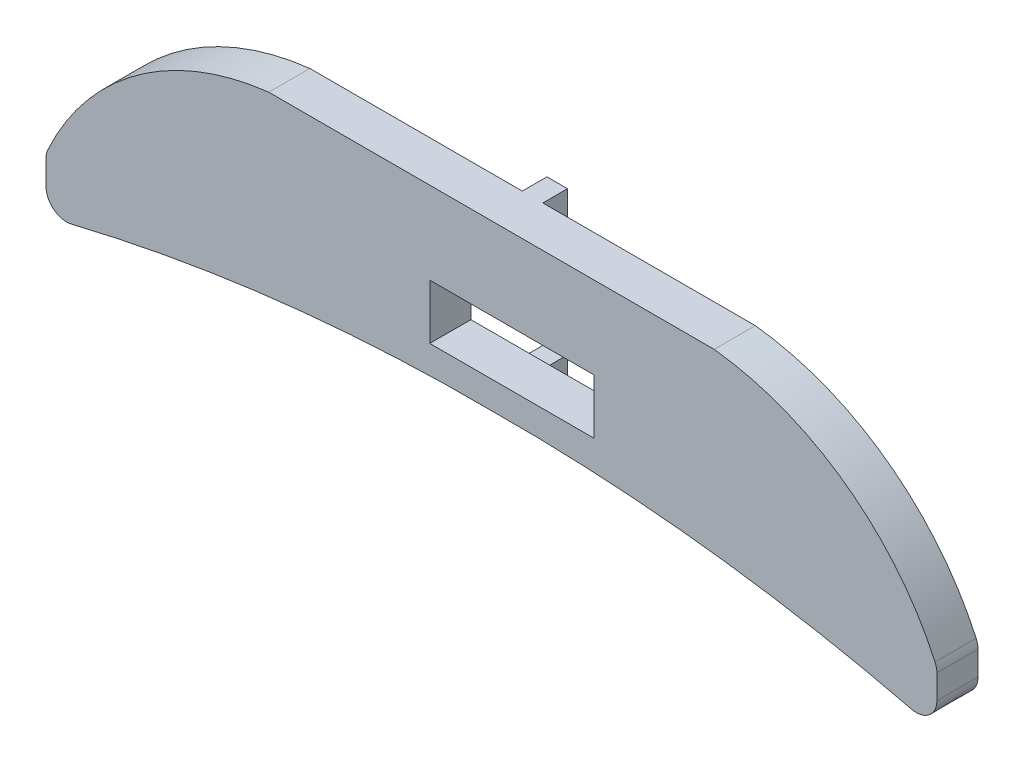
ISO-10303-21;
HEADER;
FILE_DESCRIPTION(('STEP AP214'),'2;1');
FILE_NAME('part.step','',(''),(''),'','','');
FILE_SCHEMA(('AUTOMOTIVE_DESIGN { 1 0 10303 214 1 1 1 1 }'));
ENDSEC;
DATA;
#1=APPLICATION_CONTEXT('core data for automotive mechanical design processes');
#2=APPLICATION_PROTOCOL_DEFINITION('international standard','automotive_design',2000,#1);
#3=PRODUCT_CONTEXT('',#1,'mechanical');
#4=PRODUCT('Part','Part','',(#3));
#5=PRODUCT_RELATED_PRODUCT_CATEGORY('part','',(#4));
#6=PRODUCT_DEFINITION_FORMATION('','',#4);
#7=PRODUCT_DEFINITION_CONTEXT('part definition',#1,'design');
#8=PRODUCT_DEFINITION('design','',#6,#7);
#9=PRODUCT_DEFINITION_SHAPE('','',#8);
#10=(LENGTH_UNIT() NAMED_UNIT(*) SI_UNIT(.MILLI.,.METRE.));
#11=(NAMED_UNIT(*) PLANE_ANGLE_UNIT() SI_UNIT($,.RADIAN.));
#12=(NAMED_UNIT(*) SI_UNIT($,.STERADIAN.) SOLID_ANGLE_UNIT());
#13=UNCERTAINTY_MEASURE_WITH_UNIT(LENGTH_MEASURE(1.E-05),#10,'distance_accuracy_value','');
#14=(GEOMETRIC_REPRESENTATION_CONTEXT(3) GLOBAL_UNCERTAINTY_ASSIGNED_CONTEXT((#13)) GLOBAL_UNIT_ASSIGNED_CONTEXT((#10,
#11,#12)) REPRESENTATION_CONTEXT('',''));
#15=CARTESIAN_POINT('',(0.,0.,0.));
#16=DIRECTION('',(0.,0.,1.));
#17=DIRECTION('',(1.,0.,0.));
#18=AXIS2_PLACEMENT_3D('',#15,#16,#17);
#19=CARTESIAN_POINT('',(0.,0.,0.));
#20=DIRECTION('',(0.,0.,1.));
#21=DIRECTION('',(1.,0.,0.));
#22=AXIS2_PLACEMENT_3D('',#19,#20,#21);
#23=PLANE('',#22);
#24=DIRECTION('',(0.,-1.,0.));
#25=VECTOR('',#24,1.);
#26=CARTESIAN_POINT('',(-25.,0.,0.));
#27=LINE('',#26,#25);
#28=CARTESIAN_POINT('',(-25.,6.,0.));
#29=VERTEX_POINT('',#28);
#30=CARTESIAN_POINT('',(-25.,2.,0.));
#31=VERTEX_POINT('',#30);
#32=EDGE_CURVE('E271',#29,#31,#27,.T.);
#33=ORIENTED_EDGE('',*,*,#32,.F.);
#34=DIRECTION('',(-1.,0.,0.));
#35=VECTOR('',#34,1.);
#36=CARTESIAN_POINT('',(0.,6.,0.));
#37=LINE('',#36,#35);
#38=CARTESIAN_POINT('',(-37.,6.,0.));
#39=VERTEX_POINT('',#38);
#40=EDGE_CURVE('E262',#29,#39,#37,.T.);
#41=ORIENTED_EDGE('',*,*,#40,.T.);
#42=DIRECTION('',(0.,-1.,0.));
#43=VECTOR('',#42,1.);
#44=CARTESIAN_POINT('',(-37.,0.,0.));
#45=LINE('',#44,#43);
#46=CARTESIAN_POINT('',(-37.,2.,0.));
#47=VERTEX_POINT('',#46);
#48=EDGE_CURVE('E265',#39,#47,#45,.T.);
#49=ORIENTED_EDGE('',*,*,#48,.T.);
#50=DIRECTION('',(-1.,0.,0.));
#51=VECTOR('',#50,1.);
#52=CARTESIAN_POINT('',(0.,2.,0.));
#53=LINE('',#52,#51);
#54=EDGE_CURVE('E268',#31,#47,#53,.T.);
#55=ORIENTED_EDGE('',*,*,#54,.F.);
#56=EDGE_LOOP('',(#33,#41,#49,#55));
#57=FACE_BOUND('',#56,.T.);
#58=DIRECTION('',(0.,-1.,0.));
#59=VECTOR('',#58,1.);
#60=CARTESIAN_POINT('',(-31.7500111345151,0.,0.));
#61=LINE('',#60,#59);
#62=CARTESIAN_POINT('',(-31.7500111345151,1.5,0.));
#63=VERTEX_POINT('',#62);
#64=CARTESIAN_POINT('',(-31.7500111345086,0.00408676505347211,0.));
#65=VERTEX_POINT('',#64);
#66=EDGE_CURVE('E707',#63,#65,#61,.T.);
#67=ORIENTED_EDGE('',*,*,#66,.F.);
#68=DIRECTION('',(1.,0.,0.));
#69=VECTOR('',#68,1.);
#70=CARTESIAN_POINT('',(0.,1.5,0.));
#71=LINE('',#70,#69);
#72=CARTESIAN_POINT('',(-33.2499888654849,1.5,0.));
#73=VERTEX_POINT('',#72);
#74=EDGE_CURVE('E230',#73,#63,#71,.T.);
#75=ORIENTED_EDGE('',*,*,#74,.F.);
#76=DIRECTION('',(0.,-1.,0.));
#77=VECTOR('',#76,1.);
#78=CARTESIAN_POINT('',(-33.2499888654849,0.,0.));
#79=LINE('',#78,#77);
#80=CARTESIAN_POINT('',(-33.2499888654849,0.00408676505345151,0.));
#81=VERTEX_POINT('',#80);
#82=EDGE_CURVE('E226',#73,#81,#79,.T.);
#83=ORIENTED_EDGE('',*,*,#82,.T.);
#84=CARTESIAN_POINT('',(-33.5584917745497,-125.431004331783,0.));
#85=DIRECTION('',(0.,0.,1.));
#86=DIRECTION('',(1.,0.,0.));
#87=AXIS2_PLACEMENT_3D('',#84,#85,#86);
#88=CIRCLE('',#87,125.435470471939);
#89=CARTESIAN_POINT('',(-63.1461803610039,-3.53504075370729,0.));
#90=VERTEX_POINT('',#89);
#91=EDGE_CURVE('E629',#90,#81,#88,.F.);
#92=ORIENTED_EDGE('',*,*,#91,.F.);
#93=CARTESIAN_POINT('',(-65.,-2.07736738046458,0.));
#94=CARTESIAN_POINT('',(-65.,-3.98501659018307,0.));
#95=CARTESIAN_POINT('',(-63.1461803610039,-3.53504075370726,0.));
#96=(BOUNDED_CURVE() B_SPLINE_CURVE(2,(#93,#94,#95),.UNSPECIFIED.,.F.,
.F.) B_SPLINE_CURVE_WITH_KNOTS((3,3),(0.,1.),
.UNSPECIFIED.) CURVE() GEOMETRIC_REPRESENTATION_ITEM() RATIONAL_B_SPLINE_CURVE((1.,
0.61811011990959,1.)) REPRESENTATION_ITEM(''));
#97=CARTESIAN_POINT('',(-65.,-2.07736738046458,0.));
#98=VERTEX_POINT('',#97);
#99=EDGE_CURVE('E597',#90,#98,#96,.F.);
#100=ORIENTED_EDGE('',*,*,#99,.T.);
#101=DIRECTION('',(0.,-1.,0.));
#102=VECTOR('',#101,1.);
#103=CARTESIAN_POINT('',(-65.,0.,0.));
#104=LINE('',#103,#102);
#105=CARTESIAN_POINT('',(-65.,-0.319064410268836,0.));
#106=VERTEX_POINT('',#105);
#107=EDGE_CURVE('E632',#106,#98,#104,.T.);
#108=ORIENTED_EDGE('',*,*,#107,.F.);
#109=CARTESIAN_POINT('',(-64.8649838009211,0.302883516187184,0.));
#110=CARTESIAN_POINT('',(-65.,0.00656461750580861,0.));
#111=CARTESIAN_POINT('',(-65.,-0.319064410268836,0.));
#112=(BOUNDED_CURVE() B_SPLINE_CURVE(2,(#109,#110,#111),.UNSPECIFIED.,.F.,
.F.) B_SPLINE_CURVE_WITH_KNOTS((3,3),(0.,1.),
.UNSPECIFIED.) CURVE() GEOMETRIC_REPRESENTATION_ITEM() RATIONAL_B_SPLINE_CURVE((1.,
0.977238251557438,1.)) REPRESENTATION_ITEM(''));
#113=CARTESIAN_POINT('',(-64.864983800921,0.302883516187144,0.));
#114=VERTEX_POINT('',#113);
#115=EDGE_CURVE('E459',#106,#114,#112,.F.);
#116=ORIENTED_EDGE('',*,*,#115,.T.);
#117=CARTESIAN_POINT('',(-46.4826951545868,-8.0729128114971,0.));
#118=DIRECTION('',(0.,0.,1.));
#119=DIRECTION('',(1.,0.,0.));
#120=AXIS2_PLACEMENT_3D('',#117,#118,#119);
#121=CIRCLE('',#120,20.2005569230157);
#122=CARTESIAN_POINT('',(-48.75,12.,0.));
#123=VERTEX_POINT('',#122);
#124=EDGE_CURVE('E295',#114,#123,#121,.F.);
#125=ORIENTED_EDGE('',*,*,#124,.T.);
#126=DIRECTION('',(-1.,0.,0.));
#127=VECTOR('',#126,1.);
#128=CARTESIAN_POINT('',(0.,12.,0.));
#129=LINE('',#128,#127);
#130=CARTESIAN_POINT('',(-33.2499888654849,12.,0.));
#131=VERTEX_POINT('',#130);
#132=EDGE_CURVE('E1010',#131,#123,#129,.T.);
#133=ORIENTED_EDGE('',*,*,#132,.F.);
#134=DIRECTION('',(0.,1.,0.));
#135=VECTOR('',#134,1.);
#136=CARTESIAN_POINT('',(-33.2499888654849,0.,0.));
#137=LINE('',#136,#135);
#138=CARTESIAN_POINT('',(-33.2499888654849,9.99999999999999,0.));
#139=VERTEX_POINT('',#138);
#140=EDGE_CURVE('E243',#139,#131,#137,.T.);
#141=ORIENTED_EDGE('',*,*,#140,.F.);
#142=DIRECTION('',(1.,0.,0.));
#143=VECTOR('',#142,1.);
#144=CARTESIAN_POINT('',(0.,9.99999999999999,0.));
#145=LINE('',#144,#143);
#146=CARTESIAN_POINT('',(-31.7500111345151,9.99999999999999,0.));
#147=VERTEX_POINT('',#146);
#148=EDGE_CURVE('E233',#139,#147,#145,.T.);
#149=ORIENTED_EDGE('',*,*,#148,.T.);
#150=DIRECTION('',(0.,1.,0.));
#151=VECTOR('',#150,1.);
#152=CARTESIAN_POINT('',(-31.7500111345151,0.,0.));
#153=LINE('',#152,#151);
#154=CARTESIAN_POINT('',(-31.7500111345151,12.,0.));
#155=VERTEX_POINT('',#154);
#156=EDGE_CURVE('E65',#147,#155,#153,.T.);
#157=ORIENTED_EDGE('',*,*,#156,.T.);
#158=CARTESIAN_POINT('',(-16.25,12.,0.));
#159=VERTEX_POINT('',#158);
#160=EDGE_CURVE('E305',#159,#155,#129,.T.);
#161=ORIENTED_EDGE('',*,*,#160,.F.);
#162=CARTESIAN_POINT('',(-18.5173048454132,-8.0729128114971,0.));
#163=DIRECTION('',(0.,0.,1.));
#164=DIRECTION('',(1.,0.,0.));
#165=AXIS2_PLACEMENT_3D('',#162,#163,#164);
#166=CIRCLE('',#165,20.2005569230157);
#167=CARTESIAN_POINT('',(-0.135016199078974,0.302883516187145,0.));
#168=VERTEX_POINT('',#167);
#169=EDGE_CURVE('E1007',#168,#159,#166,.T.);
#170=ORIENTED_EDGE('',*,*,#169,.F.);
#171=CARTESIAN_POINT('',(0.,-0.319064410268831,0.));
#172=CARTESIAN_POINT('',(0.,0.00656461750580541,0.));
#173=CARTESIAN_POINT('',(-0.135016199078883,0.302883516187187,0.));
#174=(BOUNDED_CURVE() B_SPLINE_CURVE(2,(#171,#172,#173),.UNSPECIFIED.,.F.,
.F.) B_SPLINE_CURVE_WITH_KNOTS((3,3),(0.,1.),
.UNSPECIFIED.) CURVE() GEOMETRIC_REPRESENTATION_ITEM() RATIONAL_B_SPLINE_CURVE((1.,
0.977238251557438,1.)) REPRESENTATION_ITEM(''));
#175=CARTESIAN_POINT('',(0.,-0.319064410268831,0.));
#176=VERTEX_POINT('',#175);
#177=EDGE_CURVE('E553',#168,#176,#174,.F.);
#178=ORIENTED_EDGE('',*,*,#177,.T.);
#179=DIRECTION('',(0.,-1.,0.));
#180=VECTOR('',#179,1.);
#181=CARTESIAN_POINT('',(0.,0.,0.));
#182=LINE('',#181,#180);
#183=CARTESIAN_POINT('',(0.,-2.07736738046458,0.));
#184=VERTEX_POINT('',#183);
#185=EDGE_CURVE('E645',#176,#184,#182,.T.);
#186=ORIENTED_EDGE('',*,*,#185,.T.);
#187=CARTESIAN_POINT('',(-1.85381963899604,-3.53504075370726,0.));
#188=CARTESIAN_POINT('',(0.,-3.98501659018305,0.));
#189=CARTESIAN_POINT('',(0.,-2.07736738046458,0.));
#190=(BOUNDED_CURVE() B_SPLINE_CURVE(2,(#187,#188,#189),.UNSPECIFIED.,.F.,
.F.) B_SPLINE_CURVE_WITH_KNOTS((3,3),(0.,1.),
.UNSPECIFIED.) CURVE() GEOMETRIC_REPRESENTATION_ITEM() RATIONAL_B_SPLINE_CURVE((1.,
0.618110119909594,1.)) REPRESENTATION_ITEM(''));
#191=CARTESIAN_POINT('',(-1.85381963899605,-3.53504075370729,0.));
#192=VERTEX_POINT('',#191);
#193=EDGE_CURVE('E503',#184,#192,#190,.F.);
#194=ORIENTED_EDGE('',*,*,#193,.T.);
#195=CARTESIAN_POINT('',(-31.4415082254503,-125.431004331783,0.));
#196=DIRECTION('',(0.,0.,1.));
#197=DIRECTION('',(1.,0.,0.));
#198=AXIS2_PLACEMENT_3D('',#195,#196,#197);
#199=CIRCLE('',#198,125.435470471939);
#200=EDGE_CURVE('E642',#192,#65,#199,.T.);
#201=ORIENTED_EDGE('',*,*,#200,.T.);
#202=EDGE_LOOP('',(#67,#75,#83,#92,#100,#108,#116,#125,#133,#141,#149,#157,#161,#170,#178,#186,
#194,#201));
#203=FACE_BOUND('',#202,.T.);
#204=ADVANCED_FACE('F37',(#57,#203),#23,.F.);
#205=CARTESIAN_POINT('',(-46.4826951545868,-8.0729128114971,3.));
#206=DIRECTION('',(0.,0.,-1.));
#207=DIRECTION('',(-1.,0.,0.));
#208=AXIS2_PLACEMENT_3D('',#205,#206,#207);
#209=CYLINDRICAL_SURFACE('',#208,20.2005569230157);
#210=ORIENTED_EDGE('',*,*,#124,.F.);
#211=CARTESIAN_POINT('',(-64.8649838009211,0.302883516187184,3.15));
#212=CARTESIAN_POINT('',(-64.8649838009211,0.302883516187184,2.05));
#213=CARTESIAN_POINT('',(-64.8649838009211,0.302883516187184,0.95));
#214=CARTESIAN_POINT('',(-64.8649838009211,0.302883516187184,-0.15));
#215=(BOUNDED_CURVE() B_SPLINE_CURVE(3,(#211,#212,#213,#214),.UNSPECIFIED.,.F.,
.F.) B_SPLINE_CURVE_WITH_KNOTS((4,4),(-0.00015,0.00315),
.UNSPECIFIED.) CURVE() GEOMETRIC_REPRESENTATION_ITEM() RATIONAL_B_SPLINE_CURVE((1.,1.,1.,1.)) REPRESENTATION_ITEM(''));
#216=CARTESIAN_POINT('',(-64.864983800921,0.302883516187144,3.));
#217=VERTEX_POINT('',#216);
#218=EDGE_CURVE('E388',#114,#217,#215,.F.);
#219=ORIENTED_EDGE('',*,*,#218,.T.);
#220=CARTESIAN_POINT('',(-46.4826951545868,-8.0729128114971,3.));
#221=DIRECTION('',(0.,0.,1.));
#222=DIRECTION('',(1.,0.,0.));
#223=AXIS2_PLACEMENT_3D('',#220,#221,#222);
#224=CIRCLE('',#223,20.2005569230157);
#225=CARTESIAN_POINT('',(-48.75,12.,3.));
#226=VERTEX_POINT('',#225);
#227=EDGE_CURVE('E301',#217,#226,#224,.F.);
#228=ORIENTED_EDGE('',*,*,#227,.T.);
#229=DIRECTION('',(0.,0.,-1.));
#230=VECTOR('',#229,1.);
#231=CARTESIAN_POINT('',(-48.75,12.,3.));
#232=LINE('',#231,#230);
#233=EDGE_CURVE('E625',#226,#123,#232,.T.);
#234=ORIENTED_EDGE('',*,*,#233,.T.);
#235=EDGE_LOOP('',(#210,#219,#228,#234));
#236=FACE_BOUND('',#235,.T.);
#237=ADVANCED_FACE('F395',(#236),#209,.T.);
#238=CARTESIAN_POINT('',(-65.,0.,3.));
#239=DIRECTION('',(1.,0.,0.));
#240=DIRECTION('',(0.,0.,-1.));
#241=AXIS2_PLACEMENT_3D('',#238,#239,#240);
#242=PLANE('',#241);
#243=ORIENTED_EDGE('',*,*,#107,.T.);
#244=CARTESIAN_POINT('',(-65.,-2.07736738046458,3.15));
#245=CARTESIAN_POINT('',(-65.,-2.07736738046458,2.05));
#246=CARTESIAN_POINT('',(-65.,-2.07736738046458,0.95));
#247=CARTESIAN_POINT('',(-65.,-2.07736738046458,-0.15));
#248=(BOUNDED_CURVE() B_SPLINE_CURVE(3,(#244,#245,#246,#247),.UNSPECIFIED.,.F.,
.F.) B_SPLINE_CURVE_WITH_KNOTS((4,4),(-0.00015,0.00315),
.UNSPECIFIED.) CURVE() GEOMETRIC_REPRESENTATION_ITEM() RATIONAL_B_SPLINE_CURVE((1.,1.,1.,1.)) REPRESENTATION_ITEM(''));
#249=CARTESIAN_POINT('',(-65.,-2.07736738046458,3.));
#250=VERTEX_POINT('',#249);
#251=EDGE_CURVE('E447',#98,#250,#248,.F.);
#252=ORIENTED_EDGE('',*,*,#251,.T.);
#253=DIRECTION('',(0.,-1.,0.));
#254=VECTOR('',#253,1.);
#255=CARTESIAN_POINT('',(-65.,0.,3.));
#256=LINE('',#255,#254);
#257=CARTESIAN_POINT('',(-65.,-0.319064410268836,3.));
#258=VERTEX_POINT('',#257);
#259=EDGE_CURVE('E304',#258,#250,#256,.T.);
#260=ORIENTED_EDGE('',*,*,#259,.F.);
#261=CARTESIAN_POINT('',(-65.,-0.319064410268836,-0.15));
#262=CARTESIAN_POINT('',(-65.,-0.319064410268836,0.95));
#263=CARTESIAN_POINT('',(-65.,-0.319064410268836,2.05));
#264=CARTESIAN_POINT('',(-65.,-0.319064410268836,3.15));
#265=(BOUNDED_CURVE() B_SPLINE_CURVE(3,(#261,#262,#263,#264),.UNSPECIFIED.,.F.,
.F.) B_SPLINE_CURVE_WITH_KNOTS((4,4),(-0.00015,0.00315),
.UNSPECIFIED.) CURVE() GEOMETRIC_REPRESENTATION_ITEM() RATIONAL_B_SPLINE_CURVE((1.,1.,1.,1.)) REPRESENTATION_ITEM(''));
#266=EDGE_CURVE('E471',#258,#106,#265,.F.);
#267=ORIENTED_EDGE('',*,*,#266,.T.);
#268=EDGE_LOOP('',(#243,#252,#260,#267));
#269=FACE_BOUND('',#268,.T.);
#270=ADVANCED_FACE('F404',(#269),#242,.F.);
#271=CARTESIAN_POINT('',(-33.5584917745497,-125.431004331783,3.));
#272=DIRECTION('',(0.,0.,-1.));
#273=DIRECTION('',(-1.,0.,0.));
#274=AXIS2_PLACEMENT_3D('',#271,#272,#273);
#275=CYLINDRICAL_SURFACE('',#274,125.435470471939);
#276=CARTESIAN_POINT('',(-33.5584917745497,-125.431004331783,3.));
#277=DIRECTION('',(0.,0.,1.));
#278=DIRECTION('',(1.,0.,0.));
#279=AXIS2_PLACEMENT_3D('',#276,#277,#278);
#280=CIRCLE('',#279,125.435470471939);
#281=CARTESIAN_POINT('',(-63.1461803610039,-3.53504075370729,3.));
#282=VERTEX_POINT('',#281);
#283=CARTESIAN_POINT('',(-32.5,0.,3.));
#284=VERTEX_POINT('',#283);
#285=EDGE_CURVE('E314',#282,#284,#280,.F.);
#286=ORIENTED_EDGE('',*,*,#285,.F.);
#287=CARTESIAN_POINT('',(-63.1461803610039,-3.53504075370726,-0.15));
#288=CARTESIAN_POINT('',(-63.1461803610039,-3.53504075370726,0.95));
#289=CARTESIAN_POINT('',(-63.1461803610039,-3.53504075370726,2.05));
#290=CARTESIAN_POINT('',(-63.1461803610039,-3.53504075370726,3.15));
#291=(BOUNDED_CURVE() B_SPLINE_CURVE(3,(#287,#288,#289,#290),.UNSPECIFIED.,.F.,
.F.) B_SPLINE_CURVE_WITH_KNOTS((4,4),(-0.00015,0.00315),
.UNSPECIFIED.) CURVE() GEOMETRIC_REPRESENTATION_ITEM() RATIONAL_B_SPLINE_CURVE((1.,1.,1.,1.)) REPRESENTATION_ITEM(''));
#292=EDGE_CURVE('E609',#282,#90,#291,.F.);
#293=ORIENTED_EDGE('',*,*,#292,.T.);
#294=ORIENTED_EDGE('',*,*,#91,.T.);
#295=DIRECTION('',(0.,0.,1.));
#296=VECTOR('',#295,1.);
#297=CARTESIAN_POINT('',(-33.2499888654914,0.00408676505347211,-1.8));
#298=LINE('',#297,#296);
#299=CARTESIAN_POINT('',(-33.2499888654914,0.00408676505347211,-1.8));
#300=VERTEX_POINT('',#299);
#301=EDGE_CURVE('E57',#300,#81,#298,.T.);
#302=ORIENTED_EDGE('',*,*,#301,.F.);
#303=CARTESIAN_POINT('',(-33.5584917745497,-125.431004331783,-1.8));
#304=DIRECTION('',(0.,0.,-1.));
#305=DIRECTION('',(-1.,0.,0.));
#306=AXIS2_PLACEMENT_3D('',#303,#304,#305);
#307=CIRCLE('',#306,125.435470471939);
#308=CARTESIAN_POINT('',(-32.5,0.,-1.8));
#309=VERTEX_POINT('',#308);
#310=EDGE_CURVE('E692',#309,#300,#307,.F.);
#311=ORIENTED_EDGE('',*,*,#310,.F.);
#312=DIRECTION('',(0.,0.,1.));
#313=VECTOR('',#312,1.);
#314=CARTESIAN_POINT('',(-32.5,0.,-1.8));
#315=LINE('',#314,#313);
#316=CARTESIAN_POINT('',(-32.5,0.,0.));
#317=VERTEX_POINT('',#316);
#318=EDGE_CURVE('E690',#309,#317,#315,.T.);
#319=ORIENTED_EDGE('',*,*,#318,.T.);
#320=DIRECTION('',(0.,0.,-1.));
#321=VECTOR('',#320,1.);
#322=CARTESIAN_POINT('',(-32.5,0.,3.));
#323=LINE('',#322,#321);
#324=EDGE_CURVE('E613',#284,#317,#323,.T.);
#325=ORIENTED_EDGE('',*,*,#324,.F.);
#326=EDGE_LOOP('',(#286,#293,#294,#302,#311,#319,#325));
#327=FACE_BOUND('',#326,.T.);
#328=ADVANCED_FACE('F688',(#327),#275,.F.);
#329=CARTESIAN_POINT('',(-31.4415082254503,-125.431004331783,3.));
#330=DIRECTION('',(0.,0.,-1.));
#331=DIRECTION('',(-1.,0.,0.));
#332=AXIS2_PLACEMENT_3D('',#329,#330,#331);
#333=CYLINDRICAL_SURFACE('',#332,125.435470471939);
#334=ORIENTED_EDGE('',*,*,#200,.F.);
#335=CARTESIAN_POINT('',(-1.85381963899604,-3.53504075370726,3.15));
#336=CARTESIAN_POINT('',(-1.85381963899604,-3.53504075370726,2.05));
#337=CARTESIAN_POINT('',(-1.85381963899604,-3.53504075370726,0.95));
#338=CARTESIAN_POINT('',(-1.85381963899604,-3.53504075370726,-0.15));
#339=(BOUNDED_CURVE() B_SPLINE_CURVE(3,(#335,#336,#337,#338),.UNSPECIFIED.,.F.,
.F.) B_SPLINE_CURVE_WITH_KNOTS((4,4),(-0.00015,0.00315),
.UNSPECIFIED.) CURVE() GEOMETRIC_REPRESENTATION_ITEM() RATIONAL_B_SPLINE_CURVE((1.,1.,1.,1.)) REPRESENTATION_ITEM(''));
#340=CARTESIAN_POINT('',(-1.85381963899605,-3.53504075370729,3.));
#341=VERTEX_POINT('',#340);
#342=EDGE_CURVE('E50',#192,#341,#339,.F.);
#343=ORIENTED_EDGE('',*,*,#342,.T.);
#344=CARTESIAN_POINT('',(-31.4415082254503,-125.431004331783,3.));
#345=DIRECTION('',(0.,0.,1.));
#346=DIRECTION('',(1.,0.,0.));
#347=AXIS2_PLACEMENT_3D('',#344,#345,#346);
#348=CIRCLE('',#347,125.435470471939);
#349=EDGE_CURVE('E310',#341,#284,#348,.T.);
#350=ORIENTED_EDGE('',*,*,#349,.T.);
#351=ORIENTED_EDGE('',*,*,#324,.T.);
#352=EDGE_CURVE('E44',#65,#317,#199,.T.);
#353=ORIENTED_EDGE('',*,*,#352,.F.);
#354=EDGE_LOOP('',(#334,#343,#350,#351,#353));
#355=FACE_BOUND('',#354,.T.);
#356=ADVANCED_FACE('F706',(#355),#333,.F.);
#357=CARTESIAN_POINT('',(0.,0.,3.));
#358=DIRECTION('',(1.,0.,0.));
#359=DIRECTION('',(0.,0.,-1.));
#360=AXIS2_PLACEMENT_3D('',#357,#358,#359);
#361=PLANE('',#360);
#362=DIRECTION('',(0.,-1.,0.));
#363=VECTOR('',#362,1.);
#364=CARTESIAN_POINT('',(0.,0.,3.));
#365=LINE('',#364,#363);
#366=CARTESIAN_POINT('',(0.,-0.319064410268831,3.));
#367=VERTEX_POINT('',#366);
#368=CARTESIAN_POINT('',(0.,-2.07736738046458,3.));
#369=VERTEX_POINT('',#368);
#370=EDGE_CURVE('E313',#367,#369,#365,.T.);
#371=ORIENTED_EDGE('',*,*,#370,.T.);
#372=CARTESIAN_POINT('',(0.,-2.07736738046458,-0.15));
#373=CARTESIAN_POINT('',(0.,-2.07736738046458,0.95));
#374=CARTESIAN_POINT('',(0.,-2.07736738046458,2.05));
#375=CARTESIAN_POINT('',(0.,-2.07736738046458,3.15));
#376=(BOUNDED_CURVE() B_SPLINE_CURVE(3,(#372,#373,#374,#375),.UNSPECIFIED.,.F.,
.F.) B_SPLINE_CURVE_WITH_KNOTS((4,4),(-0.00015,0.00315),
.UNSPECIFIED.) CURVE() GEOMETRIC_REPRESENTATION_ITEM() RATIONAL_B_SPLINE_CURVE((1.,1.,1.,1.)) REPRESENTATION_ITEM(''));
#377=EDGE_CURVE('E591',#369,#184,#376,.F.);
#378=ORIENTED_EDGE('',*,*,#377,.T.);
#379=ORIENTED_EDGE('',*,*,#185,.F.);
#380=CARTESIAN_POINT('',(0.,-0.319064410268831,3.15));
#381=CARTESIAN_POINT('',(0.,-0.319064410268831,2.05));
#382=CARTESIAN_POINT('',(0.,-0.319064410268831,0.95));
#383=CARTESIAN_POINT('',(0.,-0.319064410268831,-0.15));
#384=(BOUNDED_CURVE() B_SPLINE_CURVE(3,(#380,#381,#382,#383),.UNSPECIFIED.,.F.,
.F.) B_SPLINE_CURVE_WITH_KNOTS((4,4),(-0.00015,0.00315),
.UNSPECIFIED.) CURVE() GEOMETRIC_REPRESENTATION_ITEM() RATIONAL_B_SPLINE_CURVE((1.,1.,1.,1.)) REPRESENTATION_ITEM(''));
#385=EDGE_CURVE('E580',#176,#367,#384,.F.);
#386=ORIENTED_EDGE('',*,*,#385,.T.);
#387=EDGE_LOOP('',(#371,#378,#379,#386));
#388=FACE_BOUND('',#387,.T.);
#389=ADVANCED_FACE('F871',(#388),#361,.T.);
#390=CARTESIAN_POINT('',(-18.5173048454132,-8.0729128114971,3.));
#391=DIRECTION('',(0.,0.,-1.));
#392=DIRECTION('',(-1.,0.,0.));
#393=AXIS2_PLACEMENT_3D('',#390,#391,#392);
#394=CYLINDRICAL_SURFACE('',#393,20.2005569230157);
#395=CARTESIAN_POINT('',(-18.5173048454132,-8.0729128114971,3.));
#396=DIRECTION('',(0.,0.,1.));
#397=DIRECTION('',(1.,0.,0.));
#398=AXIS2_PLACEMENT_3D('',#395,#396,#397);
#399=CIRCLE('',#398,20.2005569230157);
#400=CARTESIAN_POINT('',(-0.135016199078974,0.302883516187145,3.));
#401=VERTEX_POINT('',#400);
#402=CARTESIAN_POINT('',(-16.25,12.,3.));
#403=VERTEX_POINT('',#402);
#404=EDGE_CURVE('E325',#401,#403,#399,.T.);
#405=ORIENTED_EDGE('',*,*,#404,.F.);
#406=CARTESIAN_POINT('',(-0.135016199078883,0.302883516187187,-0.15));
#407=CARTESIAN_POINT('',(-0.135016199078883,0.302883516187187,0.95));
#408=CARTESIAN_POINT('',(-0.135016199078883,0.302883516187187,2.05));
#409=CARTESIAN_POINT('',(-0.135016199078883,0.302883516187187,3.15));
#410=(BOUNDED_CURVE() B_SPLINE_CURVE(3,(#406,#407,#408,#409),.UNSPECIFIED.,.F.,
.F.) B_SPLINE_CURVE_WITH_KNOTS((4,4),(-0.00015,0.00315),
.UNSPECIFIED.) CURVE() GEOMETRIC_REPRESENTATION_ITEM() RATIONAL_B_SPLINE_CURVE((1.,1.,1.,1.)) REPRESENTATION_ITEM(''));
#411=EDGE_CURVE('E11',#401,#168,#410,.F.);
#412=ORIENTED_EDGE('',*,*,#411,.T.);
#413=ORIENTED_EDGE('',*,*,#169,.T.);
#414=DIRECTION('',(0.,0.,-1.));
#415=VECTOR('',#414,1.);
#416=CARTESIAN_POINT('',(-16.25,12.,3.));
#417=LINE('',#416,#415);
#418=EDGE_CURVE('E619',#403,#159,#417,.T.);
#419=ORIENTED_EDGE('',*,*,#418,.F.);
#420=EDGE_LOOP('',(#405,#412,#413,#419));
#421=FACE_BOUND('',#420,.T.);
#422=ADVANCED_FACE('F860',(#421),#394,.T.);
#423=CARTESIAN_POINT('',(0.,12.,3.));
#424=DIRECTION('',(0.,-1.,0.));
#425=DIRECTION('',(0.,0.,-1.));
#426=AXIS2_PLACEMENT_3D('',#423,#424,#425);
#427=PLANE('',#426);
#428=ORIENTED_EDGE('',*,*,#160,.T.);
#429=DIRECTION('',(0.,0.,1.));
#430=VECTOR('',#429,1.);
#431=CARTESIAN_POINT('',(-31.7500111345151,12.,-1.8));
#432=LINE('',#431,#430);
#433=CARTESIAN_POINT('',(-31.7500111345151,12.,-1.8));
#434=VERTEX_POINT('',#433);
#435=EDGE_CURVE('E249',#434,#155,#432,.T.);
#436=ORIENTED_EDGE('',*,*,#435,.F.);
#437=DIRECTION('',(1.,0.,0.));
#438=VECTOR('',#437,1.);
#439=CARTESIAN_POINT('',(0.,12.,-1.8));
#440=LINE('',#439,#438);
#441=CARTESIAN_POINT('',(-33.2499888654849,12.,-1.8));
#442=VERTEX_POINT('',#441);
#443=EDGE_CURVE('E248',#442,#434,#440,.T.);
#444=ORIENTED_EDGE('',*,*,#443,.F.);
#445=DIRECTION('',(0.,0.,1.));
#446=VECTOR('',#445,1.);
#447=CARTESIAN_POINT('',(-33.2499888654849,12.,-1.8));
#448=LINE('',#447,#446);
#449=EDGE_CURVE('E255',#442,#131,#448,.T.);
#450=ORIENTED_EDGE('',*,*,#449,.T.);
#451=ORIENTED_EDGE('',*,*,#132,.T.);
#452=ORIENTED_EDGE('',*,*,#233,.F.);
#453=DIRECTION('',(-1.,0.,0.));
#454=VECTOR('',#453,1.);
#455=CARTESIAN_POINT('',(0.,12.,3.));
#456=LINE('',#455,#454);
#457=EDGE_CURVE('E323',#403,#226,#456,.T.);
#458=ORIENTED_EDGE('',*,*,#457,.F.);
#459=ORIENTED_EDGE('',*,*,#418,.T.);
#460=EDGE_LOOP('',(#428,#436,#444,#450,#451,#452,#458,#459));
#461=FACE_BOUND('',#460,.T.);
#462=ADVANCED_FACE('F349',(#461),#427,.F.);
#463=CARTESIAN_POINT('',(0.,0.,3.));
#464=DIRECTION('',(0.,0.,1.));
#465=DIRECTION('',(1.,0.,0.));
#466=AXIS2_PLACEMENT_3D('',#463,#464,#465);
#467=PLANE('',#466);
#468=DIRECTION('',(-1.,0.,0.));
#469=VECTOR('',#468,1.);
#470=CARTESIAN_POINT('',(0.,6.,3.));
#471=LINE('',#470,#469);
#472=CARTESIAN_POINT('',(-25.,6.,3.));
#473=VERTEX_POINT('',#472);
#474=CARTESIAN_POINT('',(-37.,6.,3.));
#475=VERTEX_POINT('',#474);
#476=EDGE_CURVE('E292',#473,#475,#471,.T.);
#477=ORIENTED_EDGE('',*,*,#476,.F.);
#478=DIRECTION('',(0.,-1.,0.));
#479=VECTOR('',#478,1.);
#480=CARTESIAN_POINT('',(-25.,0.,3.));
#481=LINE('',#480,#479);
#482=CARTESIAN_POINT('',(-25.,2.,3.));
#483=VERTEX_POINT('',#482);
#484=EDGE_CURVE('E289',#473,#483,#481,.T.);
#485=ORIENTED_EDGE('',*,*,#484,.T.);
#486=DIRECTION('',(-1.,0.,0.));
#487=VECTOR('',#486,1.);
#488=CARTESIAN_POINT('',(0.,2.,3.));
#489=LINE('',#488,#487);
#490=CARTESIAN_POINT('',(-37.,2.,3.));
#491=VERTEX_POINT('',#490);
#492=EDGE_CURVE('E286',#483,#491,#489,.T.);
#493=ORIENTED_EDGE('',*,*,#492,.T.);
#494=DIRECTION('',(0.,-1.,0.));
#495=VECTOR('',#494,1.);
#496=CARTESIAN_POINT('',(-37.,0.,3.));
#497=LINE('',#496,#495);
#498=EDGE_CURVE('E277',#475,#491,#497,.T.);
#499=ORIENTED_EDGE('',*,*,#498,.F.);
#500=EDGE_LOOP('',(#477,#485,#493,#499));
#501=FACE_BOUND('',#500,.T.);
#502=ORIENTED_EDGE('',*,*,#259,.T.);
#503=CARTESIAN_POINT('',(-63.1461803610039,-3.53504075370726,3.));
#504=CARTESIAN_POINT('',(-65.,-3.98501659018307,3.));
#505=CARTESIAN_POINT('',(-65.,-2.07736738046458,3.));
#506=(BOUNDED_CURVE() B_SPLINE_CURVE(2,(#503,#504,#505),.UNSPECIFIED.,.F.,
.F.) B_SPLINE_CURVE_WITH_KNOTS((3,3),(0.,1.),
.UNSPECIFIED.) CURVE() GEOMETRIC_REPRESENTATION_ITEM() RATIONAL_B_SPLINE_CURVE((1.,
0.61811011990959,1.)) REPRESENTATION_ITEM(''));
#507=EDGE_CURVE('E374',#250,#282,#506,.F.);
#508=ORIENTED_EDGE('',*,*,#507,.T.);
#509=ORIENTED_EDGE('',*,*,#285,.T.);
#510=ORIENTED_EDGE('',*,*,#349,.F.);
#511=CARTESIAN_POINT('',(0.,-2.07736738046458,3.));
#512=CARTESIAN_POINT('',(0.,-3.98501659018305,3.));
#513=CARTESIAN_POINT('',(-1.85381963899604,-3.53504075370726,3.));
#514=(BOUNDED_CURVE() B_SPLINE_CURVE(2,(#511,#512,#513),.UNSPECIFIED.,.F.,
.F.) B_SPLINE_CURVE_WITH_KNOTS((3,3),(0.,1.),
.UNSPECIFIED.) CURVE() GEOMETRIC_REPRESENTATION_ITEM() RATIONAL_B_SPLINE_CURVE((1.,
0.618110119909594,1.)) REPRESENTATION_ITEM(''));
#515=EDGE_CURVE('E592',#341,#369,#514,.F.);
#516=ORIENTED_EDGE('',*,*,#515,.T.);
#517=ORIENTED_EDGE('',*,*,#370,.F.);
#518=CARTESIAN_POINT('',(-0.135016199078883,0.302883516187187,3.));
#519=CARTESIAN_POINT('',(0.,0.00656461750580541,3.));
#520=CARTESIAN_POINT('',(0.,-0.319064410268831,3.));
#521=(BOUNDED_CURVE() B_SPLINE_CURVE(2,(#518,#519,#520),.UNSPECIFIED.,.F.,
.F.) B_SPLINE_CURVE_WITH_KNOTS((3,3),(0.,1.),
.UNSPECIFIED.) CURVE() GEOMETRIC_REPRESENTATION_ITEM() RATIONAL_B_SPLINE_CURVE((1.,
0.977238251557438,1.)) REPRESENTATION_ITEM(''));
#522=EDGE_CURVE('E331',#367,#401,#521,.F.);
#523=ORIENTED_EDGE('',*,*,#522,.T.);
#524=ORIENTED_EDGE('',*,*,#404,.T.);
#525=ORIENTED_EDGE('',*,*,#457,.T.);
#526=ORIENTED_EDGE('',*,*,#227,.F.);
#527=CARTESIAN_POINT('',(-65.,-0.319064410268836,3.));
#528=CARTESIAN_POINT('',(-65.,0.00656461750580861,3.));
#529=CARTESIAN_POINT('',(-64.8649838009211,0.302883516187184,3.));
#530=(BOUNDED_CURVE() B_SPLINE_CURVE(2,(#527,#528,#529),.UNSPECIFIED.,.F.,
.F.) B_SPLINE_CURVE_WITH_KNOTS((3,3),(0.,1.),
.UNSPECIFIED.) CURVE() GEOMETRIC_REPRESENTATION_ITEM() RATIONAL_B_SPLINE_CURVE((1.,
0.977238251557438,1.)) REPRESENTATION_ITEM(''));
#531=EDGE_CURVE('E481',#217,#258,#530,.F.);
#532=ORIENTED_EDGE('',*,*,#531,.T.);
#533=EDGE_LOOP('',(#502,#508,#509,#510,#516,#517,#523,#524,#525,#526,#532));
#534=FACE_BOUND('',#533,.T.);
#535=ADVANCED_FACE('F338',(#501,#534),#467,.T.);
#536=ORIENTED_EDGE('',*,*,#352,.T.);
#537=DIRECTION('',(0.,1.,0.));
#538=VECTOR('',#537,1.);
#539=CARTESIAN_POINT('',(-32.5,0.,0.));
#540=LINE('',#539,#538);
#541=CARTESIAN_POINT('',(-32.5,0.00408676505343249,0.));
#542=VERTEX_POINT('',#541);
#543=EDGE_CURVE('E698',#317,#542,#540,.T.);
#544=ORIENTED_EDGE('',*,*,#543,.T.);
#545=DIRECTION('',(1.,0.,0.));
#546=VECTOR('',#545,1.);
#547=CARTESIAN_POINT('',(0.,0.00408676505343249,0.));
#548=LINE('',#547,#546);
#549=EDGE_CURVE('E704',#542,#65,#548,.T.);
#550=ORIENTED_EDGE('',*,*,#549,.T.);
#551=EDGE_LOOP('',(#536,#544,#550));
#552=FACE_BOUND('',#551,.T.);
#553=ADVANCED_FACE('F348',(#552),#23,.F.);
#554=CARTESIAN_POINT('',(0.,6.,0.));
#555=DIRECTION('',(0.,1.,0.));
#556=DIRECTION('',(0.,0.,1.));
#557=AXIS2_PLACEMENT_3D('',#554,#555,#556);
#558=PLANE('',#557);
#559=ORIENTED_EDGE('',*,*,#476,.T.);
#560=DIRECTION('',(0.,0.,1.));
#561=VECTOR('',#560,1.);
#562=CARTESIAN_POINT('',(-37.,6.,0.));
#563=LINE('',#562,#561);
#564=EDGE_CURVE('E273',#39,#475,#563,.T.);
#565=ORIENTED_EDGE('',*,*,#564,.F.);
#566=ORIENTED_EDGE('',*,*,#40,.F.);
#567=DIRECTION('',(0.,0.,1.));
#568=VECTOR('',#567,1.);
#569=CARTESIAN_POINT('',(-25.,6.,0.));
#570=LINE('',#569,#568);
#571=EDGE_CURVE('E274',#29,#473,#570,.T.);
#572=ORIENTED_EDGE('',*,*,#571,.T.);
#573=EDGE_LOOP('',(#559,#565,#566,#572));
#574=FACE_BOUND('',#573,.T.);
#575=ADVANCED_FACE('F351',(#574),#558,.F.);
#576=CARTESIAN_POINT('',(-25.,0.,0.));
#577=DIRECTION('',(-1.,0.,0.));
#578=DIRECTION('',(0.,0.,1.));
#579=AXIS2_PLACEMENT_3D('',#576,#577,#578);
#580=PLANE('',#579);
#581=ORIENTED_EDGE('',*,*,#571,.F.);
#582=ORIENTED_EDGE('',*,*,#32,.T.);
#583=DIRECTION('',(0.,0.,1.));
#584=VECTOR('',#583,1.);
#585=CARTESIAN_POINT('',(-25.,2.,0.));
#586=LINE('',#585,#584);
#587=EDGE_CURVE('E278',#31,#483,#586,.T.);
#588=ORIENTED_EDGE('',*,*,#587,.T.);
#589=ORIENTED_EDGE('',*,*,#484,.F.);
#590=EDGE_LOOP('',(#581,#582,#588,#589));
#591=FACE_BOUND('',#590,.T.);
#592=ADVANCED_FACE('F740',(#591),#580,.T.);
#593=CARTESIAN_POINT('',(0.,2.,0.));
#594=DIRECTION('',(0.,1.,0.));
#595=DIRECTION('',(0.,0.,1.));
#596=AXIS2_PLACEMENT_3D('',#593,#594,#595);
#597=PLANE('',#596);
#598=ORIENTED_EDGE('',*,*,#587,.F.);
#599=ORIENTED_EDGE('',*,*,#54,.T.);
#600=DIRECTION('',(0.,0.,1.));
#601=VECTOR('',#600,1.);
#602=CARTESIAN_POINT('',(-37.,2.,0.));
#603=LINE('',#602,#601);
#604=EDGE_CURVE('E281',#47,#491,#603,.T.);
#605=ORIENTED_EDGE('',*,*,#604,.T.);
#606=ORIENTED_EDGE('',*,*,#492,.F.);
#607=EDGE_LOOP('',(#598,#599,#605,#606));
#608=FACE_BOUND('',#607,.T.);
#609=ADVANCED_FACE('F745',(#608),#597,.T.);
#610=CARTESIAN_POINT('',(-37.,0.,0.));
#611=DIRECTION('',(-1.,0.,0.));
#612=DIRECTION('',(0.,0.,1.));
#613=AXIS2_PLACEMENT_3D('',#610,#611,#612);
#614=PLANE('',#613);
#615=ORIENTED_EDGE('',*,*,#498,.T.);
#616=ORIENTED_EDGE('',*,*,#604,.F.);
#617=ORIENTED_EDGE('',*,*,#48,.F.);
#618=ORIENTED_EDGE('',*,*,#564,.T.);
#619=EDGE_LOOP('',(#615,#616,#617,#618));
#620=FACE_BOUND('',#619,.T.);
#621=ADVANCED_FACE('F414',(#620),#614,.F.);
#622=CARTESIAN_POINT('',(-63.1461803610039,-3.53504075370726,3.15));
#623=CARTESIAN_POINT('',(-63.1461803610039,-3.53504075370726,2.05));
#624=CARTESIAN_POINT('',(-63.1461803610039,-3.53504075370726,0.95));
#625=CARTESIAN_POINT('',(-63.1461803610039,-3.53504075370726,-0.15));
#626=CARTESIAN_POINT('',(-65.,-3.98501659018307,3.15));
#627=CARTESIAN_POINT('',(-65.,-3.98501659018307,2.05));
#628=CARTESIAN_POINT('',(-65.,-3.98501659018307,0.95));
#629=CARTESIAN_POINT('',(-65.,-3.98501659018307,-0.15));
#630=CARTESIAN_POINT('',(-65.,-2.07736738046458,3.15));
#631=CARTESIAN_POINT('',(-65.,-2.07736738046458,2.05));
#632=CARTESIAN_POINT('',(-65.,-2.07736738046458,0.95));
#633=CARTESIAN_POINT('',(-65.,-2.07736738046458,-0.15));
#634=(BOUNDED_SURFACE() B_SPLINE_SURFACE(2,3,((#622,#623,#624,#625),(#626,#627,#628,#629),(#630,
#631,#632,#633)),.UNSPECIFIED.,.F.,.F.,.F.) B_SPLINE_SURFACE_WITH_KNOTS((3,3),(4,4),(0.,1.),
(-0.00015,0.00315),
.UNSPECIFIED.) GEOMETRIC_REPRESENTATION_ITEM() RATIONAL_B_SPLINE_SURFACE(((1.,1.,1.,1.),
(0.61811011990959,0.61811011990959,0.61811011990959,0.61811011990959),(1.,1.,1.,1.))) REPRESENTATION_ITEM('') SURFACE());
#635=ORIENTED_EDGE('',*,*,#507,.F.);
#636=ORIENTED_EDGE('',*,*,#251,.F.);
#637=ORIENTED_EDGE('',*,*,#99,.F.);
#638=ORIENTED_EDGE('',*,*,#292,.F.);
#639=EDGE_LOOP('',(#635,#636,#637,#638));
#640=FACE_BOUND('',#639,.T.);
#641=ADVANCED_FACE('F407',(#640),#634,.T.);
#642=CARTESIAN_POINT('',(-65.,-0.319064410268836,3.15));
#643=CARTESIAN_POINT('',(-65.,-0.319064410268836,2.05));
#644=CARTESIAN_POINT('',(-65.,-0.319064410268836,0.95));
#645=CARTESIAN_POINT('',(-65.,-0.319064410268836,-0.15));
#646=CARTESIAN_POINT('',(-65.,0.00656461750580861,3.15));
#647=CARTESIAN_POINT('',(-65.,0.00656461750580861,2.05));
#648=CARTESIAN_POINT('',(-65.,0.00656461750580861,0.95));
#649=CARTESIAN_POINT('',(-65.,0.00656461750580861,-0.15));
#650=CARTESIAN_POINT('',(-64.8649838009211,0.302883516187184,3.15));
#651=CARTESIAN_POINT('',(-64.8649838009211,0.302883516187184,2.05));
#652=CARTESIAN_POINT('',(-64.8649838009211,0.302883516187184,0.95));
#653=CARTESIAN_POINT('',(-64.8649838009211,0.302883516187184,-0.15));
#654=(BOUNDED_SURFACE() B_SPLINE_SURFACE(2,3,((#642,#643,#644,#645),(#646,#647,#648,#649),(#650,
#651,#652,#653)),.UNSPECIFIED.,.F.,.F.,.F.) B_SPLINE_SURFACE_WITH_KNOTS((3,3),(4,4),(0.,1.),
(-0.00015,0.00315),
.UNSPECIFIED.) GEOMETRIC_REPRESENTATION_ITEM() RATIONAL_B_SPLINE_SURFACE(((1.,1.,1.,1.),
(0.977238251557438,0.977238251557438,0.977238251557438,0.977238251557438),(1.,1.,1.,1.))) REPRESENTATION_ITEM('') SURFACE());
#655=ORIENTED_EDGE('',*,*,#531,.F.);
#656=ORIENTED_EDGE('',*,*,#218,.F.);
#657=ORIENTED_EDGE('',*,*,#115,.F.);
#658=ORIENTED_EDGE('',*,*,#266,.F.);
#659=EDGE_LOOP('',(#655,#656,#657,#658));
#660=FACE_BOUND('',#659,.T.);
#661=ADVANCED_FACE('F413',(#660),#654,.T.);
#662=CARTESIAN_POINT('',(0.,-2.07736738046458,3.15));
#663=CARTESIAN_POINT('',(0.,-2.07736738046458,2.05));
#664=CARTESIAN_POINT('',(0.,-2.07736738046458,0.95));
#665=CARTESIAN_POINT('',(0.,-2.07736738046458,-0.15));
#666=CARTESIAN_POINT('',(0.,-3.98501659018305,3.15));
#667=CARTESIAN_POINT('',(0.,-3.98501659018305,2.05));
#668=CARTESIAN_POINT('',(0.,-3.98501659018305,0.95));
#669=CARTESIAN_POINT('',(0.,-3.98501659018305,-0.15));
#670=CARTESIAN_POINT('',(-1.85381963899604,-3.53504075370726,3.15));
#671=CARTESIAN_POINT('',(-1.85381963899604,-3.53504075370726,2.05));
#672=CARTESIAN_POINT('',(-1.85381963899604,-3.53504075370726,0.95));
#673=CARTESIAN_POINT('',(-1.85381963899604,-3.53504075370726,-0.15));
#674=(BOUNDED_SURFACE() B_SPLINE_SURFACE(2,3,((#662,#663,#664,#665),(#666,#667,#668,#669),(#670,
#671,#672,#673)),.UNSPECIFIED.,.F.,.F.,.F.) B_SPLINE_SURFACE_WITH_KNOTS((3,3),(4,4),(0.,1.),
(-0.00015,0.00315),
.UNSPECIFIED.) GEOMETRIC_REPRESENTATION_ITEM() RATIONAL_B_SPLINE_SURFACE(((1.,1.,1.,1.),
(0.618110119909594,0.618110119909594,0.618110119909594,0.618110119909594),(1.,1.,1.,1.))) REPRESENTATION_ITEM('') SURFACE());
#675=ORIENTED_EDGE('',*,*,#515,.F.);
#676=ORIENTED_EDGE('',*,*,#342,.F.);
#677=ORIENTED_EDGE('',*,*,#193,.F.);
#678=ORIENTED_EDGE('',*,*,#377,.F.);
#679=EDGE_LOOP('',(#675,#676,#677,#678));
#680=FACE_BOUND('',#679,.T.);
#681=ADVANCED_FACE('F509',(#680),#674,.T.);
#682=CARTESIAN_POINT('',(-0.135016199078883,0.302883516187187,3.15));
#683=CARTESIAN_POINT('',(-0.135016199078883,0.302883516187187,2.05));
#684=CARTESIAN_POINT('',(-0.135016199078883,0.302883516187187,0.95));
#685=CARTESIAN_POINT('',(-0.135016199078883,0.302883516187187,-0.15));
#686=CARTESIAN_POINT('',(0.,0.00656461750580541,3.15));
#687=CARTESIAN_POINT('',(0.,0.00656461750580541,2.05));
#688=CARTESIAN_POINT('',(0.,0.00656461750580541,0.95));
#689=CARTESIAN_POINT('',(0.,0.00656461750580541,-0.15));
#690=CARTESIAN_POINT('',(0.,-0.319064410268831,3.15));
#691=CARTESIAN_POINT('',(0.,-0.319064410268831,2.05));
#692=CARTESIAN_POINT('',(0.,-0.319064410268831,0.95));
#693=CARTESIAN_POINT('',(0.,-0.319064410268831,-0.15));
#694=(BOUNDED_SURFACE() B_SPLINE_SURFACE(2,3,((#682,#683,#684,#685),(#686,#687,#688,#689),(#690,
#691,#692,#693)),.UNSPECIFIED.,.F.,.F.,.F.) B_SPLINE_SURFACE_WITH_KNOTS((3,3),(4,4),(0.,1.),
(-0.00015,0.00315),
.UNSPECIFIED.) GEOMETRIC_REPRESENTATION_ITEM() RATIONAL_B_SPLINE_SURFACE(((1.,1.,1.,1.),
(0.977238251557438,0.977238251557438,0.977238251557438,0.977238251557438),(1.,1.,1.,1.))) REPRESENTATION_ITEM('') SURFACE());
#695=ORIENTED_EDGE('',*,*,#522,.F.);
#696=ORIENTED_EDGE('',*,*,#385,.F.);
#697=ORIENTED_EDGE('',*,*,#177,.F.);
#698=ORIENTED_EDGE('',*,*,#411,.F.);
#699=EDGE_LOOP('',(#695,#696,#697,#698));
#700=FACE_BOUND('',#699,.T.);
#701=ADVANCED_FACE('F39',(#700),#694,.T.);
#702=CARTESIAN_POINT('',(-31.7500111345151,0.,-1.8));
#703=DIRECTION('',(1.,0.,0.));
#704=DIRECTION('',(0.,0.,-1.));
#705=AXIS2_PLACEMENT_3D('',#702,#703,#704);
#706=PLANE('',#705);
#707=ORIENTED_EDGE('',*,*,#156,.F.);
#708=DIRECTION('',(0.,0.,1.));
#709=VECTOR('',#708,1.);
#710=CARTESIAN_POINT('',(-31.7500111345151,9.99999999999999,-1.8));
#711=LINE('',#710,#709);
#712=CARTESIAN_POINT('',(-31.7500111345151,9.99999999999999,-1.8));
#713=VERTEX_POINT('',#712);
#714=EDGE_CURVE('E260',#713,#147,#711,.T.);
#715=ORIENTED_EDGE('',*,*,#714,.F.);
#716=DIRECTION('',(0.,1.,0.));
#717=VECTOR('',#716,1.);
#718=CARTESIAN_POINT('',(-31.7500111345151,0.,-1.8));
#719=LINE('',#718,#717);
#720=EDGE_CURVE('E239',#713,#434,#719,.T.);
#721=ORIENTED_EDGE('',*,*,#720,.T.);
#722=ORIENTED_EDGE('',*,*,#435,.T.);
#723=EDGE_LOOP('',(#707,#715,#721,#722));
#724=FACE_BOUND('',#723,.T.);
#725=ADVANCED_FACE('F762',(#724),#706,.T.);
#726=CARTESIAN_POINT('',(0.,9.99999999999999,-1.8));
#727=DIRECTION('',(0.,-1.,0.));
#728=DIRECTION('',(0.,0.,-1.));
#729=AXIS2_PLACEMENT_3D('',#726,#727,#728);
#730=PLANE('',#729);
#731=ORIENTED_EDGE('',*,*,#148,.F.);
#732=DIRECTION('',(0.,0.,1.));
#733=VECTOR('',#732,1.);
#734=CARTESIAN_POINT('',(-33.2499888654849,9.99999999999999,-1.8));
#735=LINE('',#734,#733);
#736=CARTESIAN_POINT('',(-33.2499888654849,9.99999999999999,-1.8));
#737=VERTEX_POINT('',#736);
#738=EDGE_CURVE('E258',#737,#139,#735,.T.);
#739=ORIENTED_EDGE('',*,*,#738,.F.);
#740=DIRECTION('',(1.,0.,0.));
#741=VECTOR('',#740,1.);
#742=CARTESIAN_POINT('',(0.,9.99999999999999,-1.8));
#743=LINE('',#742,#741);
#744=EDGE_CURVE('E242',#737,#713,#743,.T.);
#745=ORIENTED_EDGE('',*,*,#744,.T.);
#746=ORIENTED_EDGE('',*,*,#714,.T.);
#747=EDGE_LOOP('',(#731,#739,#745,#746));
#748=FACE_BOUND('',#747,.T.);
#749=ADVANCED_FACE('F765',(#748),#730,.T.);
#750=CARTESIAN_POINT('',(-33.2499888654849,0.,-1.8));
#751=DIRECTION('',(1.,0.,0.));
#752=DIRECTION('',(0.,0.,-1.));
#753=AXIS2_PLACEMENT_3D('',#750,#751,#752);
#754=PLANE('',#753);
#755=ORIENTED_EDGE('',*,*,#140,.T.);
#756=ORIENTED_EDGE('',*,*,#449,.F.);
#757=DIRECTION('',(0.,1.,0.));
#758=VECTOR('',#757,1.);
#759=CARTESIAN_POINT('',(-33.2499888654849,0.,-1.8));
#760=LINE('',#759,#758);
#761=EDGE_CURVE('E246',#737,#442,#760,.T.);
#762=ORIENTED_EDGE('',*,*,#761,.F.);
#763=ORIENTED_EDGE('',*,*,#738,.T.);
#764=EDGE_LOOP('',(#755,#756,#762,#763));
#765=FACE_BOUND('',#764,.T.);
#766=ADVANCED_FACE('F768',(#765),#754,.F.);
#767=CARTESIAN_POINT('',(0.,0.,-1.8));
#768=DIRECTION('',(0.,0.,-1.));
#769=DIRECTION('',(-1.,0.,0.));
#770=AXIS2_PLACEMENT_3D('',#767,#768,#769);
#771=PLANE('',#770);
#772=ORIENTED_EDGE('',*,*,#720,.F.);
#773=ORIENTED_EDGE('',*,*,#744,.F.);
#774=ORIENTED_EDGE('',*,*,#761,.T.);
#775=ORIENTED_EDGE('',*,*,#443,.T.);
#776=EDGE_LOOP('',(#772,#773,#774,#775));
#777=FACE_BOUND('',#776,.T.);
#778=ADVANCED_FACE('F772',(#777),#771,.T.);
#779=CARTESIAN_POINT('',(0.,1.5,-1.8));
#780=DIRECTION('',(0.,-1.,0.));
#781=DIRECTION('',(0.,0.,-1.));
#782=AXIS2_PLACEMENT_3D('',#779,#780,#781);
#783=PLANE('',#782);
#784=ORIENTED_EDGE('',*,*,#74,.T.);
#785=DIRECTION('',(0.,0.,1.));
#786=VECTOR('',#785,1.);
#787=CARTESIAN_POINT('',(-31.7500111345151,1.5,-1.8));
#788=LINE('',#787,#786);
#789=CARTESIAN_POINT('',(-31.7500111345151,1.5,-1.8));
#790=VERTEX_POINT('',#789);
#791=EDGE_CURVE('E212',#790,#63,#788,.T.);
#792=ORIENTED_EDGE('',*,*,#791,.F.);
#793=DIRECTION('',(1.,0.,0.));
#794=VECTOR('',#793,1.);
#795=CARTESIAN_POINT('',(0.,1.5,-1.8));
#796=LINE('',#795,#794);
#797=CARTESIAN_POINT('',(-33.2499888654849,1.5,-1.8));
#798=VERTEX_POINT('',#797);
#799=EDGE_CURVE('E219',#798,#790,#796,.T.);
#800=ORIENTED_EDGE('',*,*,#799,.F.);
#801=DIRECTION('',(0.,0.,1.));
#802=VECTOR('',#801,1.);
#803=CARTESIAN_POINT('',(-33.2499888654849,1.5,-1.8));
#804=LINE('',#803,#802);
#805=EDGE_CURVE('E714',#798,#73,#804,.T.);
#806=ORIENTED_EDGE('',*,*,#805,.T.);
#807=EDGE_LOOP('',(#784,#792,#800,#806));
#808=FACE_BOUND('',#807,.T.);
#809=ADVANCED_FACE('F228',(#808),#783,.F.);
#810=CARTESIAN_POINT('',(-31.7500111345151,0.,-1.8));
#811=DIRECTION('',(-1.,0.,0.));
#812=DIRECTION('',(0.,0.,1.));
#813=AXIS2_PLACEMENT_3D('',#810,#811,#812);
#814=PLANE('',#813);
#815=ORIENTED_EDGE('',*,*,#66,.T.);
#816=DIRECTION('',(0.,0.,1.));
#817=VECTOR('',#816,1.);
#818=CARTESIAN_POINT('',(-31.7500111345086,0.00408676505347211,-1.8));
#819=LINE('',#818,#817);
#820=CARTESIAN_POINT('',(-31.7500111345086,0.00408676505347211,-1.8));
#821=VERTEX_POINT('',#820);
#822=EDGE_CURVE('E214',#821,#65,#819,.T.);
#823=ORIENTED_EDGE('',*,*,#822,.F.);
#824=DIRECTION('',(0.,-1.,0.));
#825=VECTOR('',#824,1.);
#826=CARTESIAN_POINT('',(-31.7500111345151,0.,-1.8));
#827=LINE('',#826,#825);
#828=EDGE_CURVE('E207',#790,#821,#827,.T.);
#829=ORIENTED_EDGE('',*,*,#828,.F.);
#830=ORIENTED_EDGE('',*,*,#791,.T.);
#831=EDGE_LOOP('',(#815,#823,#829,#830));
#832=FACE_BOUND('',#831,.T.);
#833=ADVANCED_FACE('F210',(#832),#814,.F.);
#834=CARTESIAN_POINT('',(0.,0.00408676505343249,-1.8));
#835=DIRECTION('',(0.,-1.,0.));
#836=DIRECTION('',(0.,0.,-1.));
#837=AXIS2_PLACEMENT_3D('',#834,#835,#836);
#838=PLANE('',#837);
#839=ORIENTED_EDGE('',*,*,#549,.F.);
#840=DIRECTION('',(0.,0.,1.));
#841=VECTOR('',#840,1.);
#842=CARTESIAN_POINT('',(-32.5,0.00408676505343249,-1.8));
#843=LINE('',#842,#841);
#844=CARTESIAN_POINT('',(-32.5,0.00408676505343249,-1.8));
#845=VERTEX_POINT('',#844);
#846=EDGE_CURVE('E235',#845,#542,#843,.T.);
#847=ORIENTED_EDGE('',*,*,#846,.F.);
#848=DIRECTION('',(1.,0.,0.));
#849=VECTOR('',#848,1.);
#850=CARTESIAN_POINT('',(0.,0.00408676505343249,-1.8));
#851=LINE('',#850,#849);
#852=EDGE_CURVE('E218',#845,#821,#851,.T.);
#853=ORIENTED_EDGE('',*,*,#852,.T.);
#854=ORIENTED_EDGE('',*,*,#822,.T.);
#855=EDGE_LOOP('',(#839,#847,#853,#854));
#856=FACE_BOUND('',#855,.T.);
#857=ADVANCED_FACE('F721',(#856),#838,.T.);
#858=CARTESIAN_POINT('',(-32.5,0.,-1.8));
#859=DIRECTION('',(1.,0.,0.));
#860=DIRECTION('',(0.,0.,-1.));
#861=AXIS2_PLACEMENT_3D('',#858,#859,#860);
#862=PLANE('',#861);
#863=ORIENTED_EDGE('',*,*,#543,.F.);
#864=ORIENTED_EDGE('',*,*,#318,.F.);
#865=DIRECTION('',(0.,1.,0.));
#866=VECTOR('',#865,1.);
#867=CARTESIAN_POINT('',(-32.5,0.,-1.8));
#868=LINE('',#867,#866);
#869=EDGE_CURVE('E716',#309,#845,#868,.T.);
#870=ORIENTED_EDGE('',*,*,#869,.T.);
#871=ORIENTED_EDGE('',*,*,#846,.T.);
#872=EDGE_LOOP('',(#863,#864,#870,#871));
#873=FACE_BOUND('',#872,.T.);
#874=ADVANCED_FACE('F700',(#873),#862,.T.);
#875=CARTESIAN_POINT('',(-33.2499888654849,0.,-1.8));
#876=DIRECTION('',(-1.,0.,0.));
#877=DIRECTION('',(0.,0.,1.));
#878=AXIS2_PLACEMENT_3D('',#875,#876,#877);
#879=PLANE('',#878);
#880=ORIENTED_EDGE('',*,*,#82,.F.);
#881=ORIENTED_EDGE('',*,*,#805,.F.);
#882=DIRECTION('',(0.,-1.,0.));
#883=VECTOR('',#882,1.);
#884=CARTESIAN_POINT('',(-33.2499888654849,0.,-1.8));
#885=LINE('',#884,#883);
#886=EDGE_CURVE('E224',#798,#300,#885,.T.);
#887=ORIENTED_EDGE('',*,*,#886,.T.);
#888=ORIENTED_EDGE('',*,*,#301,.T.);
#889=EDGE_LOOP('',(#880,#881,#887,#888));
#890=FACE_BOUND('',#889,.T.);
#891=ADVANCED_FACE('F722',(#890),#879,.T.);
#892=CARTESIAN_POINT('',(0.,0.,-1.8));
#893=DIRECTION('',(0.,0.,-1.));
#894=DIRECTION('',(-1.,0.,0.));
#895=AXIS2_PLACEMENT_3D('',#892,#893,#894);
#896=PLANE('',#895);
#897=ORIENTED_EDGE('',*,*,#799,.T.);
#898=ORIENTED_EDGE('',*,*,#828,.T.);
#899=ORIENTED_EDGE('',*,*,#852,.F.);
#900=ORIENTED_EDGE('',*,*,#869,.F.);
#901=ORIENTED_EDGE('',*,*,#310,.T.);
#902=ORIENTED_EDGE('',*,*,#886,.F.);
#903=EDGE_LOOP('',(#897,#898,#899,#900,#901,#902));
#904=FACE_BOUND('',#903,.T.);
#905=ADVANCED_FACE('F223',(#904),#896,.T.);
#906=CLOSED_SHELL('',(#204,#237,#270,#328,#356,#389,#422,#462,#535,#553,#575,#592,#609,#621,
#641,#661,#681,#701,#725,#749,#766,#778,#809,#833,#857,#874,#891,#905));
#907=MANIFOLD_SOLID_BREP('B2',#906);
#908=ADVANCED_BREP_SHAPE_REPRESENTATION('',(#18,#907),#14);
#909=SHAPE_DEFINITION_REPRESENTATION(#9,#908);
ENDSEC;
END-ISO-10303-21;
